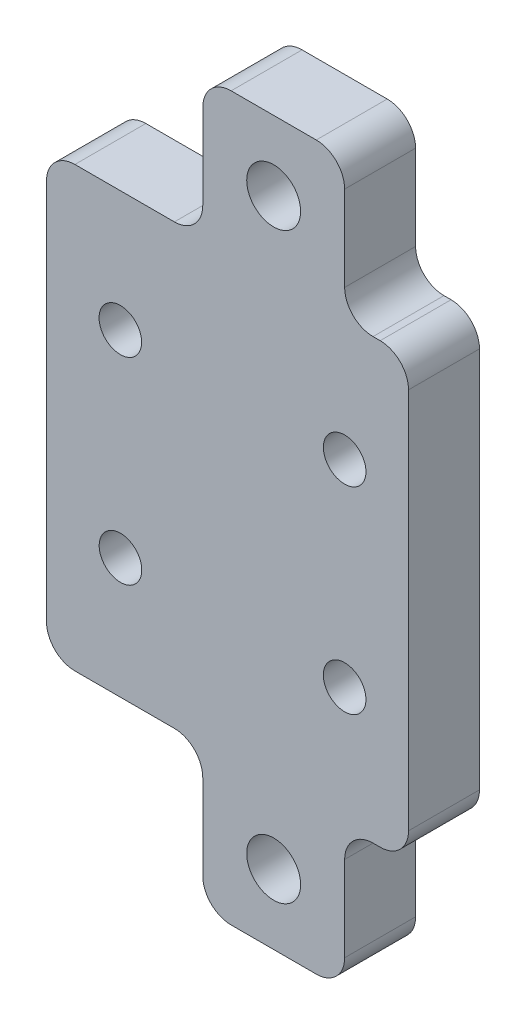
ISO-10303-21;
HEADER;
FILE_DESCRIPTION(('STEP AP214'),'2;1');
FILE_NAME('part.step','',(''),(''),'','','');
FILE_SCHEMA(('AUTOMOTIVE_DESIGN { 1 0 10303 214 1 1 1 1 }'));
ENDSEC;
DATA;
#1=APPLICATION_CONTEXT('core data for automotive mechanical design processes');
#2=APPLICATION_PROTOCOL_DEFINITION('international standard','automotive_design',2000,#1);
#3=PRODUCT_CONTEXT('',#1,'mechanical');
#4=PRODUCT('Part','Part','',(#3));
#5=PRODUCT_RELATED_PRODUCT_CATEGORY('part','',(#4));
#6=PRODUCT_DEFINITION_FORMATION('','',#4);
#7=PRODUCT_DEFINITION_CONTEXT('part definition',#1,'design');
#8=PRODUCT_DEFINITION('design','',#6,#7);
#9=PRODUCT_DEFINITION_SHAPE('','',#8);
#10=(LENGTH_UNIT() NAMED_UNIT(*) SI_UNIT(.MILLI.,.METRE.));
#11=(NAMED_UNIT(*) PLANE_ANGLE_UNIT() SI_UNIT($,.RADIAN.));
#12=(NAMED_UNIT(*) SI_UNIT($,.STERADIAN.) SOLID_ANGLE_UNIT());
#13=UNCERTAINTY_MEASURE_WITH_UNIT(LENGTH_MEASURE(1.E-05),#10,'distance_accuracy_value','');
#14=(GEOMETRIC_REPRESENTATION_CONTEXT(3) GLOBAL_UNCERTAINTY_ASSIGNED_CONTEXT((#13)) GLOBAL_UNIT_ASSIGNED_CONTEXT((#10,
#11,#12)) REPRESENTATION_CONTEXT('',''));
#15=CARTESIAN_POINT('',(0.,0.,0.));
#16=DIRECTION('',(0.,0.,1.));
#17=DIRECTION('',(1.,0.,0.));
#18=AXIS2_PLACEMENT_3D('',#15,#16,#17);
#19=CARTESIAN_POINT('',(-2.99733029540138,-264.787047369331,5.));
#20=DIRECTION('',(0.,0.,1.));
#21=DIRECTION('',(1.,0.,0.));
#22=AXIS2_PLACEMENT_3D('',#19,#20,#21);
#23=PLANE('',#22);
#24=CARTESIAN_POINT('',(5.00266970459864,-248.275086094937,5.));
#25=DIRECTION('',(0.,0.,1.));
#26=DIRECTION('',(1.,0.,0.));
#27=AXIS2_PLACEMENT_3D('',#24,#25,#26);
#28=CIRCLE('',#27,1.49999999999999);
#29=CARTESIAN_POINT('',(6.50266970459863,-248.275086094937,5.));
#30=VERTEX_POINT('',#29);
#31=EDGE_CURVE('E534',#30,#30,#28,.T.);
#32=ORIENTED_EDGE('',*,*,#31,.F.);
#33=EDGE_LOOP('',(#32));
#34=FACE_BOUND('',#33,.T.);
#35=CARTESIAN_POINT('',(0.,-261.876090751215,5.));
#36=DIRECTION('',(0.,0.,1.));
#37=DIRECTION('',(1.,0.,0.));
#38=AXIS2_PLACEMENT_3D('',#35,#36,#37);
#39=CIRCLE('',#38,1.90000000000001);
#40=CARTESIAN_POINT('',(1.90000000000001,-261.876090751215,5.));
#41=VERTEX_POINT('',#40);
#42=EDGE_CURVE('E550',#41,#41,#39,.T.);
#43=ORIENTED_EDGE('',*,*,#42,.F.);
#44=EDGE_LOOP('',(#43));
#45=FACE_BOUND('',#44,.T.);
#46=CARTESIAN_POINT('',(5.00266970459862,-234.375086094937,5.));
#47=DIRECTION('',(0.,0.,1.));
#48=DIRECTION('',(1.,0.,0.));
#49=AXIS2_PLACEMENT_3D('',#46,#47,#48);
#50=CIRCLE('',#49,1.50080097819596);
#51=CARTESIAN_POINT('',(6.50347068279458,-234.375086094937,5.));
#52=VERTEX_POINT('',#51);
#53=EDGE_CURVE('E244',#52,#52,#50,.T.);
#54=ORIENTED_EDGE('',*,*,#53,.F.);
#55=EDGE_LOOP('',(#54));
#56=FACE_BOUND('',#55,.T.);
#57=CARTESIAN_POINT('',(-2.99733029540138,-264.787047369331,5.));
#58=DIRECTION('',(0.,0.,1.));
#59=DIRECTION('',(1.,0.,0.));
#60=AXIS2_PLACEMENT_3D('',#57,#58,#59);
#61=CIRCLE('',#60,2.);
#62=CARTESIAN_POINT('',(-4.99733029540138,-264.787047369331,5.));
#63=VERTEX_POINT('',#62);
#64=CARTESIAN_POINT('',(-2.99733029540136,-266.787047369331,5.));
#65=VERTEX_POINT('',#64);
#66=EDGE_CURVE('E310',#63,#65,#61,.T.);
#67=ORIENTED_EDGE('',*,*,#66,.T.);
#68=DIRECTION('',(1.,0.,0.));
#69=VECTOR('',#68,1.);
#70=CARTESIAN_POINT('',(-2.99733029540136,-266.787047369331,5.));
#71=LINE('',#70,#69);
#72=CARTESIAN_POINT('',(3.00266970459861,-266.787047369331,5.));
#73=VERTEX_POINT('',#72);
#74=EDGE_CURVE('E150',#65,#73,#71,.T.);
#75=ORIENTED_EDGE('',*,*,#74,.T.);
#76=CARTESIAN_POINT('',(3.00266970459862,-264.787047369331,5.));
#77=DIRECTION('',(0.,0.,1.));
#78=DIRECTION('',(1.,0.,0.));
#79=AXIS2_PLACEMENT_3D('',#76,#77,#78);
#80=CIRCLE('',#79,2.);
#81=CARTESIAN_POINT('',(5.00266970459862,-264.787047369331,5.));
#82=VERTEX_POINT('',#81);
#83=EDGE_CURVE('E395',#73,#82,#80,.T.);
#84=ORIENTED_EDGE('',*,*,#83,.T.);
#85=DIRECTION('',(0.,1.,0.));
#86=VECTOR('',#85,1.);
#87=CARTESIAN_POINT('',(5.00266970459862,-258.787047369331,5.));
#88=LINE('',#87,#86);
#89=CARTESIAN_POINT('',(5.00266970459862,-258.787047369331,5.));
#90=VERTEX_POINT('',#89);
#91=EDGE_CURVE('E415',#82,#90,#88,.T.);
#92=ORIENTED_EDGE('',*,*,#91,.T.);
#93=CARTESIAN_POINT('',(7.00266970459862,-258.787047369331,5.));
#94=DIRECTION('',(0.,0.,-1.));
#95=DIRECTION('',(1.,0.,0.));
#96=AXIS2_PLACEMENT_3D('',#93,#94,#95);
#97=CIRCLE('',#96,2.);
#98=CARTESIAN_POINT('',(7.00266970459864,-256.787047369331,5.));
#99=VERTEX_POINT('',#98);
#100=EDGE_CURVE('E411',#90,#99,#97,.T.);
#101=ORIENTED_EDGE('',*,*,#100,.T.);
#102=DIRECTION('',(1.,0.,0.));
#103=VECTOR('',#102,1.);
#104=CARTESIAN_POINT('',(7.50507286190779,-256.787047369331,5.));
#105=LINE('',#104,#103);
#106=CARTESIAN_POINT('',(7.50507286190779,-256.787047369331,5.));
#107=VERTEX_POINT('',#106);
#108=EDGE_CURVE('E414',#99,#107,#105,.T.);
#109=ORIENTED_EDGE('',*,*,#108,.T.);
#110=CARTESIAN_POINT('',(7.50507286190781,-254.787047369331,5.));
#111=DIRECTION('',(0.,0.,1.));
#112=DIRECTION('',(-1.,0.,0.));
#113=AXIS2_PLACEMENT_3D('',#110,#111,#112);
#114=CIRCLE('',#113,2.);
#115=CARTESIAN_POINT('',(9.50507286190781,-254.787047369331,5.));
#116=VERTEX_POINT('',#115);
#117=EDGE_CURVE('E419',#107,#116,#114,.T.);
#118=ORIENTED_EDGE('',*,*,#117,.T.);
#119=DIRECTION('',(0.,1.,0.));
#120=VECTOR('',#119,1.);
#121=CARTESIAN_POINT('',(9.50507286190781,-227.870547218494,5.));
#122=LINE('',#121,#120);
#123=CARTESIAN_POINT('',(9.50507286190781,-227.870547218494,5.));
#124=VERTEX_POINT('',#123);
#125=EDGE_CURVE('E426',#116,#124,#122,.T.);
#126=ORIENTED_EDGE('',*,*,#125,.T.);
#127=CARTESIAN_POINT('',(7.50507286190781,-227.870547218494,5.));
#128=DIRECTION('',(0.,0.,1.));
#129=DIRECTION('',(-1.,0.,0.));
#130=AXIS2_PLACEMENT_3D('',#127,#128,#129);
#131=CIRCLE('',#130,2.);
#132=CARTESIAN_POINT('',(7.50507286190779,-225.870547218494,5.));
#133=VERTEX_POINT('',#132);
#134=EDGE_CURVE('E429',#124,#133,#131,.T.);
#135=ORIENTED_EDGE('',*,*,#134,.T.);
#136=DIRECTION('',(-1.,0.,0.));
#137=VECTOR('',#136,1.);
#138=CARTESIAN_POINT('',(7.50507286190779,-225.870547218494,5.));
#139=LINE('',#138,#137);
#140=CARTESIAN_POINT('',(7.00266970459864,-225.870547218494,5.));
#141=VERTEX_POINT('',#140);
#142=EDGE_CURVE('E432',#133,#141,#139,.T.);
#143=ORIENTED_EDGE('',*,*,#142,.T.);
#144=CARTESIAN_POINT('',(7.00266970459862,-223.870547218494,5.));
#145=DIRECTION('',(0.,0.,-1.));
#146=DIRECTION('',(-1.,0.,0.));
#147=AXIS2_PLACEMENT_3D('',#144,#145,#146);
#148=CIRCLE('',#147,2.);
#149=CARTESIAN_POINT('',(5.00266970459862,-223.870547218494,5.));
#150=VERTEX_POINT('',#149);
#151=EDGE_CURVE('E435',#141,#150,#148,.T.);
#152=ORIENTED_EDGE('',*,*,#151,.T.);
#153=DIRECTION('',(0.,1.,0.));
#154=VECTOR('',#153,1.);
#155=CARTESIAN_POINT('',(5.00266970459862,-223.870547218494,5.));
#156=LINE('',#155,#154);
#157=CARTESIAN_POINT('',(5.00266970459862,-217.870547218494,5.));
#158=VERTEX_POINT('',#157);
#159=EDGE_CURVE('E438',#150,#158,#156,.T.);
#160=ORIENTED_EDGE('',*,*,#159,.T.);
#161=CARTESIAN_POINT('',(3.00266970459862,-217.870547218494,5.));
#162=DIRECTION('',(0.,0.,1.));
#163=DIRECTION('',(-1.,0.,0.));
#164=AXIS2_PLACEMENT_3D('',#161,#162,#163);
#165=CIRCLE('',#164,2.);
#166=CARTESIAN_POINT('',(3.00266970459861,-215.870547218494,5.));
#167=VERTEX_POINT('',#166);
#168=EDGE_CURVE('E441',#158,#167,#165,.T.);
#169=ORIENTED_EDGE('',*,*,#168,.T.);
#170=DIRECTION('',(-1.,0.,0.));
#171=VECTOR('',#170,1.);
#172=CARTESIAN_POINT('',(-2.99733029540136,-215.870547218494,5.));
#173=LINE('',#172,#171);
#174=CARTESIAN_POINT('',(-2.99733029540136,-215.870547218494,5.));
#175=VERTEX_POINT('',#174);
#176=EDGE_CURVE('E444',#167,#175,#173,.T.);
#177=ORIENTED_EDGE('',*,*,#176,.T.);
#178=CARTESIAN_POINT('',(-2.99733029540138,-217.870547218494,5.));
#179=DIRECTION('',(0.,0.,1.));
#180=DIRECTION('',(-1.,0.,0.));
#181=AXIS2_PLACEMENT_3D('',#178,#179,#180);
#182=CIRCLE('',#181,2.);
#183=CARTESIAN_POINT('',(-4.99733029540138,-217.870547218494,5.));
#184=VERTEX_POINT('',#183);
#185=EDGE_CURVE('E447',#175,#184,#182,.T.);
#186=ORIENTED_EDGE('',*,*,#185,.T.);
#187=DIRECTION('',(0.,-1.,0.));
#188=VECTOR('',#187,1.);
#189=CARTESIAN_POINT('',(-4.99733029540138,-223.870547218494,5.));
#190=LINE('',#189,#188);
#191=CARTESIAN_POINT('',(-4.99733029540138,-223.870547218494,5.));
#192=VERTEX_POINT('',#191);
#193=EDGE_CURVE('E450',#184,#192,#190,.T.);
#194=ORIENTED_EDGE('',*,*,#193,.T.);
#195=CARTESIAN_POINT('',(-6.99733029540138,-223.870547218494,5.));
#196=DIRECTION('',(0.,0.,-1.));
#197=DIRECTION('',(1.,0.,0.));
#198=AXIS2_PLACEMENT_3D('',#195,#196,#197);
#199=CIRCLE('',#198,2.);
#200=CARTESIAN_POINT('',(-6.99733029540139,-225.870547218494,5.));
#201=VERTEX_POINT('',#200);
#202=EDGE_CURVE('E453',#192,#201,#199,.T.);
#203=ORIENTED_EDGE('',*,*,#202,.T.);
#204=DIRECTION('',(-1.,0.,0.));
#205=VECTOR('',#204,1.);
#206=CARTESIAN_POINT('',(-6.99733029540139,-225.870547218494,5.));
#207=LINE('',#206,#205);
#208=CARTESIAN_POINT('',(-14.0085439901449,-225.870547218494,5.));
#209=VERTEX_POINT('',#208);
#210=EDGE_CURVE('E456',#201,#209,#207,.T.);
#211=ORIENTED_EDGE('',*,*,#210,.T.);
#212=CARTESIAN_POINT('',(-14.008543990145,-227.870547218494,5.));
#213=DIRECTION('',(0.,0.,1.));
#214=DIRECTION('',(1.,0.,0.));
#215=AXIS2_PLACEMENT_3D('',#212,#213,#214);
#216=CIRCLE('',#215,2.);
#217=CARTESIAN_POINT('',(-16.008543990145,-227.870547218494,5.));
#218=VERTEX_POINT('',#217);
#219=EDGE_CURVE('E459',#209,#218,#216,.T.);
#220=ORIENTED_EDGE('',*,*,#219,.T.);
#221=DIRECTION('',(0.,-1.,0.));
#222=VECTOR('',#221,1.);
#223=CARTESIAN_POINT('',(-16.008543990145,-227.870547218494,5.));
#224=LINE('',#223,#222);
#225=CARTESIAN_POINT('',(-16.008543990145,-254.787047369331,5.));
#226=VERTEX_POINT('',#225);
#227=EDGE_CURVE('E462',#218,#226,#224,.T.);
#228=ORIENTED_EDGE('',*,*,#227,.T.);
#229=CARTESIAN_POINT('',(-14.008543990145,-254.787047369331,5.));
#230=DIRECTION('',(0.,0.,1.));
#231=DIRECTION('',(-1.,0.,0.));
#232=AXIS2_PLACEMENT_3D('',#229,#230,#231);
#233=CIRCLE('',#232,2.);
#234=CARTESIAN_POINT('',(-14.0085439901449,-256.787047369331,5.));
#235=VERTEX_POINT('',#234);
#236=EDGE_CURVE('E217',#226,#235,#233,.T.);
#237=ORIENTED_EDGE('',*,*,#236,.T.);
#238=DIRECTION('',(1.,0.,0.));
#239=VECTOR('',#238,1.);
#240=CARTESIAN_POINT('',(-6.99733029540139,-256.787047369331,5.));
#241=LINE('',#240,#239);
#242=CARTESIAN_POINT('',(-6.99733029540139,-256.787047369331,5.));
#243=VERTEX_POINT('',#242);
#244=EDGE_CURVE('E211',#235,#243,#241,.T.);
#245=ORIENTED_EDGE('',*,*,#244,.T.);
#246=CARTESIAN_POINT('',(-6.99733029540138,-258.787047369331,5.));
#247=DIRECTION('',(0.,0.,-1.));
#248=DIRECTION('',(-1.,0.,0.));
#249=AXIS2_PLACEMENT_3D('',#246,#247,#248);
#250=CIRCLE('',#249,2.);
#251=CARTESIAN_POINT('',(-4.99733029540138,-258.787047369331,5.));
#252=VERTEX_POINT('',#251);
#253=EDGE_CURVE('E215',#243,#252,#250,.T.);
#254=ORIENTED_EDGE('',*,*,#253,.T.);
#255=DIRECTION('',(0.,-1.,0.));
#256=VECTOR('',#255,1.);
#257=CARTESIAN_POINT('',(-4.99733029540138,-258.787047369331,5.));
#258=LINE('',#257,#256);
#259=EDGE_CURVE('E59',#252,#63,#258,.T.);
#260=ORIENTED_EDGE('',*,*,#259,.T.);
#261=EDGE_LOOP('',(#67,#75,#84,#92,#101,#109,#118,#126,#135,#143,#152,#160,#169,#177,#186,#194,
#203,#211,#220,#228,#237,#245,#254,#260));
#262=FACE_BOUND('',#261,.T.);
#263=CARTESIAN_POINT('',(-10.8057672657323,-234.375086094937,5.));
#264=DIRECTION('',(0.,0.,1.));
#265=DIRECTION('',(1.,0.,0.));
#266=AXIS2_PLACEMENT_3D('',#263,#264,#265);
#267=CIRCLE('',#266,1.50080097819596);
#268=CARTESIAN_POINT('',(-9.3049662875363,-234.375086094937,5.));
#269=VERTEX_POINT('',#268);
#270=EDGE_CURVE('E558',#269,#269,#267,.T.);
#271=ORIENTED_EDGE('',*,*,#270,.F.);
#272=EDGE_LOOP('',(#271));
#273=FACE_BOUND('',#272,.T.);
#274=CARTESIAN_POINT('',(0.,-220.781503836609,5.));
#275=DIRECTION('',(0.,0.,1.));
#276=DIRECTION('',(-1.,0.,0.));
#277=AXIS2_PLACEMENT_3D('',#274,#275,#276);
#278=CIRCLE('',#277,1.90000000000001);
#279=CARTESIAN_POINT('',(-1.90000000000001,-220.781503836609,5.));
#280=VERTEX_POINT('',#279);
#281=EDGE_CURVE('E542',#280,#280,#278,.T.);
#282=ORIENTED_EDGE('',*,*,#281,.F.);
#283=EDGE_LOOP('',(#282));
#284=FACE_BOUND('',#283,.T.);
#285=CARTESIAN_POINT('',(-10.7973302954014,-248.275086094937,5.));
#286=DIRECTION('',(0.,0.,1.));
#287=DIRECTION('',(1.,0.,0.));
#288=AXIS2_PLACEMENT_3D('',#285,#286,#287);
#289=CIRCLE('',#288,1.49999999999999);
#290=CARTESIAN_POINT('',(-9.29733029540137,-248.275086094937,5.));
#291=VERTEX_POINT('',#290);
#292=EDGE_CURVE('E523',#291,#291,#289,.T.);
#293=ORIENTED_EDGE('',*,*,#292,.F.);
#294=EDGE_LOOP('',(#293));
#295=FACE_BOUND('',#294,.T.);
#296=ADVANCED_FACE('F41',(#34,#45,#56,#262,#273,#284,#295),#23,.T.);
#297=CARTESIAN_POINT('',(-2.99733029540138,-264.787047369331,0.));
#298=DIRECTION('',(0.,0.,1.));
#299=DIRECTION('',(1.,0.,0.));
#300=AXIS2_PLACEMENT_3D('',#297,#298,#299);
#301=PLANE('',#300);
#302=CARTESIAN_POINT('',(-2.99733029540138,-264.787047369331,0.));
#303=DIRECTION('',(0.,0.,1.));
#304=DIRECTION('',(1.,0.,0.));
#305=AXIS2_PLACEMENT_3D('',#302,#303,#304);
#306=CIRCLE('',#305,2.);
#307=CARTESIAN_POINT('',(-4.99733029540138,-264.787047369331,0.));
#308=VERTEX_POINT('',#307);
#309=CARTESIAN_POINT('',(-2.99733029540136,-266.787047369331,0.));
#310=VERTEX_POINT('',#309);
#311=EDGE_CURVE('E239',#308,#310,#306,.T.);
#312=ORIENTED_EDGE('',*,*,#311,.F.);
#313=DIRECTION('',(0.,-1.,0.));
#314=VECTOR('',#313,1.);
#315=CARTESIAN_POINT('',(-4.99733029540138,-258.787047369331,0.));
#316=LINE('',#315,#314);
#317=CARTESIAN_POINT('',(-4.99733029540138,-258.787047369331,0.));
#318=VERTEX_POINT('',#317);
#319=EDGE_CURVE('E142',#318,#308,#316,.T.);
#320=ORIENTED_EDGE('',*,*,#319,.F.);
#321=CARTESIAN_POINT('',(-6.99733029540138,-258.787047369331,0.));
#322=DIRECTION('',(0.,0.,-1.));
#323=DIRECTION('',(-1.,0.,0.));
#324=AXIS2_PLACEMENT_3D('',#321,#322,#323);
#325=CIRCLE('',#324,2.);
#326=CARTESIAN_POINT('',(-6.99733029540139,-256.787047369331,0.));
#327=VERTEX_POINT('',#326);
#328=EDGE_CURVE('E136',#327,#318,#325,.T.);
#329=ORIENTED_EDGE('',*,*,#328,.F.);
#330=DIRECTION('',(1.,0.,0.));
#331=VECTOR('',#330,1.);
#332=CARTESIAN_POINT('',(-6.99733029540139,-256.787047369331,0.));
#333=LINE('',#332,#331);
#334=CARTESIAN_POINT('',(-14.0085439901449,-256.787047369331,0.));
#335=VERTEX_POINT('',#334);
#336=EDGE_CURVE('E226',#335,#327,#333,.T.);
#337=ORIENTED_EDGE('',*,*,#336,.F.);
#338=CARTESIAN_POINT('',(-14.008543990145,-254.787047369331,0.));
#339=DIRECTION('',(0.,0.,1.));
#340=DIRECTION('',(-1.,0.,0.));
#341=AXIS2_PLACEMENT_3D('',#338,#339,#340);
#342=CIRCLE('',#341,2.);
#343=CARTESIAN_POINT('',(-16.008543990145,-254.787047369331,0.));
#344=VERTEX_POINT('',#343);
#345=EDGE_CURVE('E301',#344,#335,#342,.T.);
#346=ORIENTED_EDGE('',*,*,#345,.F.);
#347=DIRECTION('',(0.,-1.,0.));
#348=VECTOR('',#347,1.);
#349=CARTESIAN_POINT('',(-16.008543990145,-227.870547218494,0.));
#350=LINE('',#349,#348);
#351=CARTESIAN_POINT('',(-16.008543990145,-227.870547218494,0.));
#352=VERTEX_POINT('',#351);
#353=EDGE_CURVE('E298',#352,#344,#350,.T.);
#354=ORIENTED_EDGE('',*,*,#353,.F.);
#355=CARTESIAN_POINT('',(-14.008543990145,-227.870547218494,0.));
#356=DIRECTION('',(0.,0.,1.));
#357=DIRECTION('',(1.,0.,0.));
#358=AXIS2_PLACEMENT_3D('',#355,#356,#357);
#359=CIRCLE('',#358,2.);
#360=CARTESIAN_POINT('',(-14.0085439901449,-225.870547218494,0.));
#361=VERTEX_POINT('',#360);
#362=EDGE_CURVE('E295',#361,#352,#359,.T.);
#363=ORIENTED_EDGE('',*,*,#362,.F.);
#364=DIRECTION('',(-1.,0.,0.));
#365=VECTOR('',#364,1.);
#366=CARTESIAN_POINT('',(-6.99733029540139,-225.870547218494,0.));
#367=LINE('',#366,#365);
#368=CARTESIAN_POINT('',(-6.99733029540139,-225.870547218494,0.));
#369=VERTEX_POINT('',#368);
#370=EDGE_CURVE('E292',#369,#361,#367,.T.);
#371=ORIENTED_EDGE('',*,*,#370,.F.);
#372=CARTESIAN_POINT('',(-6.99733029540138,-223.870547218494,0.));
#373=DIRECTION('',(0.,0.,-1.));
#374=DIRECTION('',(1.,0.,0.));
#375=AXIS2_PLACEMENT_3D('',#372,#373,#374);
#376=CIRCLE('',#375,2.);
#377=CARTESIAN_POINT('',(-4.99733029540138,-223.870547218494,0.));
#378=VERTEX_POINT('',#377);
#379=EDGE_CURVE('E289',#378,#369,#376,.T.);
#380=ORIENTED_EDGE('',*,*,#379,.F.);
#381=DIRECTION('',(0.,-1.,0.));
#382=VECTOR('',#381,1.);
#383=CARTESIAN_POINT('',(-4.99733029540138,-223.870547218494,0.));
#384=LINE('',#383,#382);
#385=CARTESIAN_POINT('',(-4.99733029540138,-217.870547218494,0.));
#386=VERTEX_POINT('',#385);
#387=EDGE_CURVE('E286',#386,#378,#384,.T.);
#388=ORIENTED_EDGE('',*,*,#387,.F.);
#389=CARTESIAN_POINT('',(-2.99733029540138,-217.870547218494,0.));
#390=DIRECTION('',(0.,0.,1.));
#391=DIRECTION('',(-1.,0.,0.));
#392=AXIS2_PLACEMENT_3D('',#389,#390,#391);
#393=CIRCLE('',#392,2.);
#394=CARTESIAN_POINT('',(-2.99733029540136,-215.870547218494,0.));
#395=VERTEX_POINT('',#394);
#396=EDGE_CURVE('E283',#395,#386,#393,.T.);
#397=ORIENTED_EDGE('',*,*,#396,.F.);
#398=DIRECTION('',(-1.,0.,0.));
#399=VECTOR('',#398,1.);
#400=CARTESIAN_POINT('',(-2.99733029540136,-215.870547218494,0.));
#401=LINE('',#400,#399);
#402=CARTESIAN_POINT('',(3.00266970459861,-215.870547218494,0.));
#403=VERTEX_POINT('',#402);
#404=EDGE_CURVE('E280',#403,#395,#401,.T.);
#405=ORIENTED_EDGE('',*,*,#404,.F.);
#406=CARTESIAN_POINT('',(3.00266970459862,-217.870547218494,0.));
#407=DIRECTION('',(0.,0.,1.));
#408=DIRECTION('',(-1.,0.,0.));
#409=AXIS2_PLACEMENT_3D('',#406,#407,#408);
#410=CIRCLE('',#409,2.);
#411=CARTESIAN_POINT('',(5.00266970459862,-217.870547218494,0.));
#412=VERTEX_POINT('',#411);
#413=EDGE_CURVE('E277',#412,#403,#410,.T.);
#414=ORIENTED_EDGE('',*,*,#413,.F.);
#415=DIRECTION('',(0.,1.,0.));
#416=VECTOR('',#415,1.);
#417=CARTESIAN_POINT('',(5.00266970459862,-223.870547218494,0.));
#418=LINE('',#417,#416);
#419=CARTESIAN_POINT('',(5.00266970459862,-223.870547218494,0.));
#420=VERTEX_POINT('',#419);
#421=EDGE_CURVE('E274',#420,#412,#418,.T.);
#422=ORIENTED_EDGE('',*,*,#421,.F.);
#423=CARTESIAN_POINT('',(7.00266970459862,-223.870547218494,0.));
#424=DIRECTION('',(0.,0.,-1.));
#425=DIRECTION('',(-1.,0.,0.));
#426=AXIS2_PLACEMENT_3D('',#423,#424,#425);
#427=CIRCLE('',#426,2.);
#428=CARTESIAN_POINT('',(7.00266970459864,-225.870547218494,0.));
#429=VERTEX_POINT('',#428);
#430=EDGE_CURVE('E271',#429,#420,#427,.T.);
#431=ORIENTED_EDGE('',*,*,#430,.F.);
#432=DIRECTION('',(-1.,0.,0.));
#433=VECTOR('',#432,1.);
#434=CARTESIAN_POINT('',(7.50507286190779,-225.870547218494,0.));
#435=LINE('',#434,#433);
#436=CARTESIAN_POINT('',(7.50507286190779,-225.870547218494,0.));
#437=VERTEX_POINT('',#436);
#438=EDGE_CURVE('E268',#437,#429,#435,.T.);
#439=ORIENTED_EDGE('',*,*,#438,.F.);
#440=CARTESIAN_POINT('',(7.50507286190781,-227.870547218494,0.));
#441=DIRECTION('',(0.,0.,1.));
#442=DIRECTION('',(-1.,0.,0.));
#443=AXIS2_PLACEMENT_3D('',#440,#441,#442);
#444=CIRCLE('',#443,2.);
#445=CARTESIAN_POINT('',(9.50507286190781,-227.870547218494,0.));
#446=VERTEX_POINT('',#445);
#447=EDGE_CURVE('E265',#446,#437,#444,.T.);
#448=ORIENTED_EDGE('',*,*,#447,.F.);
#449=DIRECTION('',(0.,1.,0.));
#450=VECTOR('',#449,1.);
#451=CARTESIAN_POINT('',(9.50507286190781,-227.870547218494,0.));
#452=LINE('',#451,#450);
#453=CARTESIAN_POINT('',(9.50507286190781,-254.787047369331,0.));
#454=VERTEX_POINT('',#453);
#455=EDGE_CURVE('E262',#454,#446,#452,.T.);
#456=ORIENTED_EDGE('',*,*,#455,.F.);
#457=CARTESIAN_POINT('',(7.50507286190781,-254.787047369331,0.));
#458=DIRECTION('',(0.,0.,1.));
#459=DIRECTION('',(-1.,0.,0.));
#460=AXIS2_PLACEMENT_3D('',#457,#458,#459);
#461=CIRCLE('',#460,2.);
#462=CARTESIAN_POINT('',(7.50507286190779,-256.787047369331,0.));
#463=VERTEX_POINT('',#462);
#464=EDGE_CURVE('E259',#463,#454,#461,.T.);
#465=ORIENTED_EDGE('',*,*,#464,.F.);
#466=DIRECTION('',(1.,0.,0.));
#467=VECTOR('',#466,1.);
#468=CARTESIAN_POINT('',(7.50507286190779,-256.787047369331,0.));
#469=LINE('',#468,#467);
#470=CARTESIAN_POINT('',(7.00266970459864,-256.787047369331,0.));
#471=VERTEX_POINT('',#470);
#472=EDGE_CURVE('E256',#471,#463,#469,.T.);
#473=ORIENTED_EDGE('',*,*,#472,.F.);
#474=CARTESIAN_POINT('',(7.00266970459862,-258.787047369331,0.));
#475=DIRECTION('',(0.,0.,-1.));
#476=DIRECTION('',(1.,0.,0.));
#477=AXIS2_PLACEMENT_3D('',#474,#475,#476);
#478=CIRCLE('',#477,2.);
#479=CARTESIAN_POINT('',(5.00266970459862,-258.787047369331,0.));
#480=VERTEX_POINT('',#479);
#481=EDGE_CURVE('E253',#480,#471,#478,.T.);
#482=ORIENTED_EDGE('',*,*,#481,.F.);
#483=DIRECTION('',(0.,1.,0.));
#484=VECTOR('',#483,1.);
#485=CARTESIAN_POINT('',(5.00266970459862,-258.787047369331,0.));
#486=LINE('',#485,#484);
#487=CARTESIAN_POINT('',(5.00266970459862,-264.787047369331,0.));
#488=VERTEX_POINT('',#487);
#489=EDGE_CURVE('E250',#488,#480,#486,.T.);
#490=ORIENTED_EDGE('',*,*,#489,.F.);
#491=CARTESIAN_POINT('',(3.00266970459862,-264.787047369331,0.));
#492=DIRECTION('',(0.,0.,1.));
#493=DIRECTION('',(1.,0.,0.));
#494=AXIS2_PLACEMENT_3D('',#491,#492,#493);
#495=CIRCLE('',#494,2.);
#496=CARTESIAN_POINT('',(3.00266970459861,-266.787047369331,0.));
#497=VERTEX_POINT('',#496);
#498=EDGE_CURVE('E247',#497,#488,#495,.T.);
#499=ORIENTED_EDGE('',*,*,#498,.F.);
#500=DIRECTION('',(1.,0.,0.));
#501=VECTOR('',#500,1.);
#502=CARTESIAN_POINT('',(-2.99733029540136,-266.787047369331,0.));
#503=LINE('',#502,#501);
#504=EDGE_CURVE('E243',#310,#497,#503,.T.);
#505=ORIENTED_EDGE('',*,*,#504,.F.);
#506=EDGE_LOOP('',(#312,#320,#329,#337,#346,#354,#363,#371,#380,#388,#397,#405,#414,#422,#431,
#439,#448,#456,#465,#473,#482,#490,#499,#505));
#507=FACE_BOUND('',#506,.T.);
#508=CARTESIAN_POINT('',(5.00266970459862,-234.375086094937,0.));
#509=DIRECTION('',(0.,0.,1.));
#510=DIRECTION('',(1.,0.,0.));
#511=AXIS2_PLACEMENT_3D('',#508,#509,#510);
#512=CIRCLE('',#511,1.50080097819596);
#513=CARTESIAN_POINT('',(6.50347068279458,-234.375086094937,0.));
#514=VERTEX_POINT('',#513);
#515=EDGE_CURVE('E562',#514,#514,#512,.T.);
#516=ORIENTED_EDGE('',*,*,#515,.T.);
#517=EDGE_LOOP('',(#516));
#518=FACE_BOUND('',#517,.T.);
#519=CARTESIAN_POINT('',(-10.8057672657323,-234.375086094937,0.));
#520=DIRECTION('',(0.,0.,1.));
#521=DIRECTION('',(1.,0.,0.));
#522=AXIS2_PLACEMENT_3D('',#519,#520,#521);
#523=CIRCLE('',#522,1.50080097819596);
#524=CARTESIAN_POINT('',(-9.3049662875363,-234.375086094937,0.));
#525=VERTEX_POINT('',#524);
#526=EDGE_CURVE('E554',#525,#525,#523,.T.);
#527=ORIENTED_EDGE('',*,*,#526,.T.);
#528=EDGE_LOOP('',(#527));
#529=FACE_BOUND('',#528,.T.);
#530=CARTESIAN_POINT('',(0.,-261.876090751215,0.));
#531=DIRECTION('',(0.,0.,1.));
#532=DIRECTION('',(1.,0.,0.));
#533=AXIS2_PLACEMENT_3D('',#530,#531,#532);
#534=CIRCLE('',#533,1.90000000000001);
#535=CARTESIAN_POINT('',(1.90000000000001,-261.876090751215,0.));
#536=VERTEX_POINT('',#535);
#537=EDGE_CURVE('E546',#536,#536,#534,.T.);
#538=ORIENTED_EDGE('',*,*,#537,.T.);
#539=EDGE_LOOP('',(#538));
#540=FACE_BOUND('',#539,.T.);
#541=CARTESIAN_POINT('',(0.,-220.781503836609,0.));
#542=DIRECTION('',(0.,0.,1.));
#543=DIRECTION('',(-1.,0.,0.));
#544=AXIS2_PLACEMENT_3D('',#541,#542,#543);
#545=CIRCLE('',#544,1.90000000000001);
#546=CARTESIAN_POINT('',(-1.90000000000001,-220.781503836609,0.));
#547=VERTEX_POINT('',#546);
#548=EDGE_CURVE('E538',#547,#547,#545,.T.);
#549=ORIENTED_EDGE('',*,*,#548,.T.);
#550=EDGE_LOOP('',(#549));
#551=FACE_BOUND('',#550,.T.);
#552=CARTESIAN_POINT('',(5.00266970459864,-248.275086094937,0.));
#553=DIRECTION('',(0.,0.,1.));
#554=DIRECTION('',(1.,0.,0.));
#555=AXIS2_PLACEMENT_3D('',#552,#553,#554);
#556=CIRCLE('',#555,1.49999999999999);
#557=CARTESIAN_POINT('',(6.50266970459863,-248.275086094937,0.));
#558=VERTEX_POINT('',#557);
#559=EDGE_CURVE('E531',#558,#558,#556,.T.);
#560=ORIENTED_EDGE('',*,*,#559,.T.);
#561=EDGE_LOOP('',(#560));
#562=FACE_BOUND('',#561,.T.);
#563=CARTESIAN_POINT('',(-10.7973302954014,-248.275086094937,0.));
#564=DIRECTION('',(0.,0.,1.));
#565=DIRECTION('',(1.,0.,0.));
#566=AXIS2_PLACEMENT_3D('',#563,#564,#565);
#567=CIRCLE('',#566,1.49999999999999);
#568=CARTESIAN_POINT('',(-9.29733029540137,-248.275086094937,0.));
#569=VERTEX_POINT('',#568);
#570=EDGE_CURVE('E526',#569,#569,#567,.T.);
#571=ORIENTED_EDGE('',*,*,#570,.T.);
#572=EDGE_LOOP('',(#571));
#573=FACE_BOUND('',#572,.T.);
#574=ADVANCED_FACE('F399',(#507,#518,#529,#540,#551,#562,#573),#301,.F.);
#575=CARTESIAN_POINT('',(-2.99733029540138,-264.787047369331,5.));
#576=DIRECTION('',(0.,0.,-1.));
#577=DIRECTION('',(-1.,0.,0.));
#578=AXIS2_PLACEMENT_3D('',#575,#576,#577);
#579=CYLINDRICAL_SURFACE('',#578,2.);
#580=ORIENTED_EDGE('',*,*,#311,.T.);
#581=DIRECTION('',(0.,0.,-1.));
#582=VECTOR('',#581,1.);
#583=CARTESIAN_POINT('',(-2.99733029540136,-266.787047369331,5.));
#584=LINE('',#583,#582);
#585=EDGE_CURVE('E11',#65,#310,#584,.T.);
#586=ORIENTED_EDGE('',*,*,#585,.F.);
#587=ORIENTED_EDGE('',*,*,#66,.F.);
#588=DIRECTION('',(0.,0.,-1.));
#589=VECTOR('',#588,1.);
#590=CARTESIAN_POINT('',(-4.99733029540138,-264.787047369331,5.));
#591=LINE('',#590,#589);
#592=EDGE_CURVE('E235',#63,#308,#591,.T.);
#593=ORIENTED_EDGE('',*,*,#592,.T.);
#594=EDGE_LOOP('',(#580,#586,#587,#593));
#595=FACE_BOUND('',#594,.T.);
#596=ADVANCED_FACE('F43',(#595),#579,.T.);
#597=CARTESIAN_POINT('',(-2.99733029540136,-266.787047369331,5.));
#598=DIRECTION('',(0.,1.,0.));
#599=DIRECTION('',(0.,0.,1.));
#600=AXIS2_PLACEMENT_3D('',#597,#598,#599);
#601=PLANE('',#600);
#602=ORIENTED_EDGE('',*,*,#504,.T.);
#603=DIRECTION('',(0.,0.,-1.));
#604=VECTOR('',#603,1.);
#605=CARTESIAN_POINT('',(3.00266970459861,-266.787047369331,5.));
#606=LINE('',#605,#604);
#607=EDGE_CURVE('E51',#73,#497,#606,.T.);
#608=ORIENTED_EDGE('',*,*,#607,.F.);
#609=ORIENTED_EDGE('',*,*,#74,.F.);
#610=ORIENTED_EDGE('',*,*,#585,.T.);
#611=EDGE_LOOP('',(#602,#608,#609,#610));
#612=FACE_BOUND('',#611,.T.);
#613=ADVANCED_FACE('F838',(#612),#601,.F.);
#614=CARTESIAN_POINT('',(3.00266970459862,-264.787047369331,5.));
#615=DIRECTION('',(0.,0.,-1.));
#616=DIRECTION('',(-1.,0.,0.));
#617=AXIS2_PLACEMENT_3D('',#614,#615,#616);
#618=CYLINDRICAL_SURFACE('',#617,2.);
#619=ORIENTED_EDGE('',*,*,#498,.T.);
#620=DIRECTION('',(0.,0.,-1.));
#621=VECTOR('',#620,1.);
#622=CARTESIAN_POINT('',(5.00266970459862,-264.787047369331,5.));
#623=LINE('',#622,#621);
#624=EDGE_CURVE('E385',#82,#488,#623,.T.);
#625=ORIENTED_EDGE('',*,*,#624,.F.);
#626=ORIENTED_EDGE('',*,*,#83,.F.);
#627=ORIENTED_EDGE('',*,*,#607,.T.);
#628=EDGE_LOOP('',(#619,#625,#626,#627));
#629=FACE_BOUND('',#628,.T.);
#630=ADVANCED_FACE('F393',(#629),#618,.T.);
#631=CARTESIAN_POINT('',(5.00266970459862,-258.787047369331,5.));
#632=DIRECTION('',(-1.,0.,0.));
#633=DIRECTION('',(0.,-1.,0.));
#634=AXIS2_PLACEMENT_3D('',#631,#632,#633);
#635=PLANE('',#634);
#636=ORIENTED_EDGE('',*,*,#489,.T.);
#637=DIRECTION('',(0.,0.,-1.));
#638=VECTOR('',#637,1.);
#639=CARTESIAN_POINT('',(5.00266970459862,-258.787047369331,5.));
#640=LINE('',#639,#638);
#641=EDGE_CURVE('E381',#90,#480,#640,.T.);
#642=ORIENTED_EDGE('',*,*,#641,.F.);
#643=ORIENTED_EDGE('',*,*,#91,.F.);
#644=ORIENTED_EDGE('',*,*,#624,.T.);
#645=EDGE_LOOP('',(#636,#642,#643,#644));
#646=FACE_BOUND('',#645,.T.);
#647=ADVANCED_FACE('F405',(#646),#635,.F.);
#648=CARTESIAN_POINT('',(7.00266970459862,-258.787047369331,5.));
#649=DIRECTION('',(0.,0.,-1.));
#650=DIRECTION('',(-1.,0.,0.));
#651=AXIS2_PLACEMENT_3D('',#648,#649,#650);
#652=CYLINDRICAL_SURFACE('',#651,2.);
#653=ORIENTED_EDGE('',*,*,#481,.T.);
#654=DIRECTION('',(0.,0.,-1.));
#655=VECTOR('',#654,1.);
#656=CARTESIAN_POINT('',(7.00266970459864,-256.787047369331,5.));
#657=LINE('',#656,#655);
#658=EDGE_CURVE('E377',#99,#471,#657,.T.);
#659=ORIENTED_EDGE('',*,*,#658,.F.);
#660=ORIENTED_EDGE('',*,*,#100,.F.);
#661=ORIENTED_EDGE('',*,*,#641,.T.);
#662=EDGE_LOOP('',(#653,#659,#660,#661));
#663=FACE_BOUND('',#662,.T.);
#664=ADVANCED_FACE('F409',(#663),#652,.F.);
#665=CARTESIAN_POINT('',(7.50507286190779,-256.787047369331,5.));
#666=DIRECTION('',(0.,1.,0.));
#667=DIRECTION('',(0.,0.,1.));
#668=AXIS2_PLACEMENT_3D('',#665,#666,#667);
#669=PLANE('',#668);
#670=ORIENTED_EDGE('',*,*,#472,.T.);
#671=DIRECTION('',(0.,0.,-1.));
#672=VECTOR('',#671,1.);
#673=CARTESIAN_POINT('',(7.50507286190779,-256.787047369331,5.));
#674=LINE('',#673,#672);
#675=EDGE_CURVE('E373',#107,#463,#674,.T.);
#676=ORIENTED_EDGE('',*,*,#675,.F.);
#677=ORIENTED_EDGE('',*,*,#108,.F.);
#678=ORIENTED_EDGE('',*,*,#658,.T.);
#679=EDGE_LOOP('',(#670,#676,#677,#678));
#680=FACE_BOUND('',#679,.T.);
#681=ADVANCED_FACE('F799',(#680),#669,.F.);
#682=CARTESIAN_POINT('',(7.50507286190781,-254.787047369331,5.));
#683=DIRECTION('',(0.,0.,-1.));
#684=DIRECTION('',(-1.,0.,0.));
#685=AXIS2_PLACEMENT_3D('',#682,#683,#684);
#686=CYLINDRICAL_SURFACE('',#685,2.);
#687=ORIENTED_EDGE('',*,*,#464,.T.);
#688=DIRECTION('',(0.,0.,-1.));
#689=VECTOR('',#688,1.);
#690=CARTESIAN_POINT('',(9.50507286190781,-254.787047369331,5.));
#691=LINE('',#690,#689);
#692=EDGE_CURVE('E369',#116,#454,#691,.T.);
#693=ORIENTED_EDGE('',*,*,#692,.F.);
#694=ORIENTED_EDGE('',*,*,#117,.F.);
#695=ORIENTED_EDGE('',*,*,#675,.T.);
#696=EDGE_LOOP('',(#687,#693,#694,#695));
#697=FACE_BOUND('',#696,.T.);
#698=ADVANCED_FACE('F788',(#697),#686,.T.);
#699=CARTESIAN_POINT('',(9.50507286190781,-227.870547218494,5.));
#700=DIRECTION('',(-1.,0.,0.));
#701=DIRECTION('',(0.,0.,1.));
#702=AXIS2_PLACEMENT_3D('',#699,#700,#701);
#703=PLANE('',#702);
#704=ORIENTED_EDGE('',*,*,#455,.T.);
#705=DIRECTION('',(0.,0.,-1.));
#706=VECTOR('',#705,1.);
#707=CARTESIAN_POINT('',(9.50507286190781,-227.870547218494,5.));
#708=LINE('',#707,#706);
#709=EDGE_CURVE('E365',#124,#446,#708,.T.);
#710=ORIENTED_EDGE('',*,*,#709,.F.);
#711=ORIENTED_EDGE('',*,*,#125,.F.);
#712=ORIENTED_EDGE('',*,*,#692,.T.);
#713=EDGE_LOOP('',(#704,#710,#711,#712));
#714=FACE_BOUND('',#713,.T.);
#715=ADVANCED_FACE('F777',(#714),#703,.F.);
#716=CARTESIAN_POINT('',(7.50507286190781,-227.870547218494,5.));
#717=DIRECTION('',(0.,0.,-1.));
#718=DIRECTION('',(-1.,0.,0.));
#719=AXIS2_PLACEMENT_3D('',#716,#717,#718);
#720=CYLINDRICAL_SURFACE('',#719,2.);
#721=ORIENTED_EDGE('',*,*,#447,.T.);
#722=DIRECTION('',(0.,0.,-1.));
#723=VECTOR('',#722,1.);
#724=CARTESIAN_POINT('',(7.50507286190779,-225.870547218494,5.));
#725=LINE('',#724,#723);
#726=EDGE_CURVE('E361',#133,#437,#725,.T.);
#727=ORIENTED_EDGE('',*,*,#726,.F.);
#728=ORIENTED_EDGE('',*,*,#134,.F.);
#729=ORIENTED_EDGE('',*,*,#709,.T.);
#730=EDGE_LOOP('',(#721,#727,#728,#729));
#731=FACE_BOUND('',#730,.T.);
#732=ADVANCED_FACE('F766',(#731),#720,.T.);
#733=CARTESIAN_POINT('',(7.50507286190779,-225.870547218494,5.));
#734=DIRECTION('',(0.,-1.,0.));
#735=DIRECTION('',(0.,0.,-1.));
#736=AXIS2_PLACEMENT_3D('',#733,#734,#735);
#737=PLANE('',#736);
#738=ORIENTED_EDGE('',*,*,#438,.T.);
#739=DIRECTION('',(0.,0.,-1.));
#740=VECTOR('',#739,1.);
#741=CARTESIAN_POINT('',(7.00266970459864,-225.870547218494,5.));
#742=LINE('',#741,#740);
#743=EDGE_CURVE('E357',#141,#429,#742,.T.);
#744=ORIENTED_EDGE('',*,*,#743,.F.);
#745=ORIENTED_EDGE('',*,*,#142,.F.);
#746=ORIENTED_EDGE('',*,*,#726,.T.);
#747=EDGE_LOOP('',(#738,#744,#745,#746));
#748=FACE_BOUND('',#747,.T.);
#749=ADVANCED_FACE('F755',(#748),#737,.F.);
#750=CARTESIAN_POINT('',(7.00266970459862,-223.870547218494,5.));
#751=DIRECTION('',(0.,0.,-1.));
#752=DIRECTION('',(-1.,0.,0.));
#753=AXIS2_PLACEMENT_3D('',#750,#751,#752);
#754=CYLINDRICAL_SURFACE('',#753,2.);
#755=ORIENTED_EDGE('',*,*,#430,.T.);
#756=DIRECTION('',(0.,0.,-1.));
#757=VECTOR('',#756,1.);
#758=CARTESIAN_POINT('',(5.00266970459862,-223.870547218494,5.));
#759=LINE('',#758,#757);
#760=EDGE_CURVE('E353',#150,#420,#759,.T.);
#761=ORIENTED_EDGE('',*,*,#760,.F.);
#762=ORIENTED_EDGE('',*,*,#151,.F.);
#763=ORIENTED_EDGE('',*,*,#743,.T.);
#764=EDGE_LOOP('',(#755,#761,#762,#763));
#765=FACE_BOUND('',#764,.T.);
#766=ADVANCED_FACE('F744',(#765),#754,.F.);
#767=CARTESIAN_POINT('',(5.00266970459862,-223.870547218494,5.));
#768=DIRECTION('',(-1.,0.,0.));
#769=DIRECTION('',(0.,-1.,0.));
#770=AXIS2_PLACEMENT_3D('',#767,#768,#769);
#771=PLANE('',#770);
#772=ORIENTED_EDGE('',*,*,#421,.T.);
#773=DIRECTION('',(0.,0.,-1.));
#774=VECTOR('',#773,1.);
#775=CARTESIAN_POINT('',(5.00266970459862,-217.870547218494,5.));
#776=LINE('',#775,#774);
#777=EDGE_CURVE('E349',#158,#412,#776,.T.);
#778=ORIENTED_EDGE('',*,*,#777,.F.);
#779=ORIENTED_EDGE('',*,*,#159,.F.);
#780=ORIENTED_EDGE('',*,*,#760,.T.);
#781=EDGE_LOOP('',(#772,#778,#779,#780));
#782=FACE_BOUND('',#781,.T.);
#783=ADVANCED_FACE('F733',(#782),#771,.F.);
#784=CARTESIAN_POINT('',(3.00266970459862,-217.870547218494,5.));
#785=DIRECTION('',(0.,0.,-1.));
#786=DIRECTION('',(-1.,0.,0.));
#787=AXIS2_PLACEMENT_3D('',#784,#785,#786);
#788=CYLINDRICAL_SURFACE('',#787,2.);
#789=ORIENTED_EDGE('',*,*,#413,.T.);
#790=DIRECTION('',(0.,0.,-1.));
#791=VECTOR('',#790,1.);
#792=CARTESIAN_POINT('',(3.00266970459861,-215.870547218494,5.));
#793=LINE('',#792,#791);
#794=EDGE_CURVE('E345',#167,#403,#793,.T.);
#795=ORIENTED_EDGE('',*,*,#794,.F.);
#796=ORIENTED_EDGE('',*,*,#168,.F.);
#797=ORIENTED_EDGE('',*,*,#777,.T.);
#798=EDGE_LOOP('',(#789,#795,#796,#797));
#799=FACE_BOUND('',#798,.T.);
#800=ADVANCED_FACE('F722',(#799),#788,.T.);
#801=CARTESIAN_POINT('',(-2.99733029540136,-215.870547218494,5.));
#802=DIRECTION('',(0.,-1.,0.));
#803=DIRECTION('',(0.,0.,-1.));
#804=AXIS2_PLACEMENT_3D('',#801,#802,#803);
#805=PLANE('',#804);
#806=ORIENTED_EDGE('',*,*,#404,.T.);
#807=DIRECTION('',(0.,0.,-1.));
#808=VECTOR('',#807,1.);
#809=CARTESIAN_POINT('',(-2.99733029540136,-215.870547218494,5.));
#810=LINE('',#809,#808);
#811=EDGE_CURVE('E341',#175,#395,#810,.T.);
#812=ORIENTED_EDGE('',*,*,#811,.F.);
#813=ORIENTED_EDGE('',*,*,#176,.F.);
#814=ORIENTED_EDGE('',*,*,#794,.T.);
#815=EDGE_LOOP('',(#806,#812,#813,#814));
#816=FACE_BOUND('',#815,.T.);
#817=ADVANCED_FACE('F711',(#816),#805,.F.);
#818=CARTESIAN_POINT('',(-2.99733029540138,-217.870547218494,5.));
#819=DIRECTION('',(0.,0.,-1.));
#820=DIRECTION('',(-1.,0.,0.));
#821=AXIS2_PLACEMENT_3D('',#818,#819,#820);
#822=CYLINDRICAL_SURFACE('',#821,2.);
#823=ORIENTED_EDGE('',*,*,#396,.T.);
#824=DIRECTION('',(0.,0.,-1.));
#825=VECTOR('',#824,1.);
#826=CARTESIAN_POINT('',(-4.99733029540138,-217.870547218494,5.));
#827=LINE('',#826,#825);
#828=EDGE_CURVE('E337',#184,#386,#827,.T.);
#829=ORIENTED_EDGE('',*,*,#828,.F.);
#830=ORIENTED_EDGE('',*,*,#185,.F.);
#831=ORIENTED_EDGE('',*,*,#811,.T.);
#832=EDGE_LOOP('',(#823,#829,#830,#831));
#833=FACE_BOUND('',#832,.T.);
#834=ADVANCED_FACE('F700',(#833),#822,.T.);
#835=CARTESIAN_POINT('',(-4.99733029540138,-223.870547218494,5.));
#836=DIRECTION('',(1.,0.,0.));
#837=DIRECTION('',(0.,0.,-1.));
#838=AXIS2_PLACEMENT_3D('',#835,#836,#837);
#839=PLANE('',#838);
#840=ORIENTED_EDGE('',*,*,#387,.T.);
#841=DIRECTION('',(0.,0.,-1.));
#842=VECTOR('',#841,1.);
#843=CARTESIAN_POINT('',(-4.99733029540138,-223.870547218494,5.));
#844=LINE('',#843,#842);
#845=EDGE_CURVE('E333',#192,#378,#844,.T.);
#846=ORIENTED_EDGE('',*,*,#845,.F.);
#847=ORIENTED_EDGE('',*,*,#193,.F.);
#848=ORIENTED_EDGE('',*,*,#828,.T.);
#849=EDGE_LOOP('',(#840,#846,#847,#848));
#850=FACE_BOUND('',#849,.T.);
#851=ADVANCED_FACE('F689',(#850),#839,.F.);
#852=CARTESIAN_POINT('',(-6.99733029540138,-223.870547218494,5.));
#853=DIRECTION('',(0.,0.,-1.));
#854=DIRECTION('',(-1.,0.,0.));
#855=AXIS2_PLACEMENT_3D('',#852,#853,#854);
#856=CYLINDRICAL_SURFACE('',#855,2.);
#857=ORIENTED_EDGE('',*,*,#379,.T.);
#858=DIRECTION('',(0.,0.,-1.));
#859=VECTOR('',#858,1.);
#860=CARTESIAN_POINT('',(-6.99733029540139,-225.870547218494,5.));
#861=LINE('',#860,#859);
#862=EDGE_CURVE('E329',#201,#369,#861,.T.);
#863=ORIENTED_EDGE('',*,*,#862,.F.);
#864=ORIENTED_EDGE('',*,*,#202,.F.);
#865=ORIENTED_EDGE('',*,*,#845,.T.);
#866=EDGE_LOOP('',(#857,#863,#864,#865));
#867=FACE_BOUND('',#866,.T.);
#868=ADVANCED_FACE('F678',(#867),#856,.F.);
#869=CARTESIAN_POINT('',(-6.99733029540139,-225.870547218494,5.));
#870=DIRECTION('',(0.,-1.,0.));
#871=DIRECTION('',(0.,0.,-1.));
#872=AXIS2_PLACEMENT_3D('',#869,#870,#871);
#873=PLANE('',#872);
#874=ORIENTED_EDGE('',*,*,#370,.T.);
#875=DIRECTION('',(0.,0.,-1.));
#876=VECTOR('',#875,1.);
#877=CARTESIAN_POINT('',(-14.0085439901449,-225.870547218494,5.));
#878=LINE('',#877,#876);
#879=EDGE_CURVE('E325',#209,#361,#878,.T.);
#880=ORIENTED_EDGE('',*,*,#879,.F.);
#881=ORIENTED_EDGE('',*,*,#210,.F.);
#882=ORIENTED_EDGE('',*,*,#862,.T.);
#883=EDGE_LOOP('',(#874,#880,#881,#882));
#884=FACE_BOUND('',#883,.T.);
#885=ADVANCED_FACE('F667',(#884),#873,.F.);
#886=CARTESIAN_POINT('',(-14.008543990145,-227.870547218494,5.));
#887=DIRECTION('',(0.,0.,-1.));
#888=DIRECTION('',(-1.,0.,0.));
#889=AXIS2_PLACEMENT_3D('',#886,#887,#888);
#890=CYLINDRICAL_SURFACE('',#889,2.);
#891=ORIENTED_EDGE('',*,*,#362,.T.);
#892=DIRECTION('',(0.,0.,-1.));
#893=VECTOR('',#892,1.);
#894=CARTESIAN_POINT('',(-16.008543990145,-227.870547218494,5.));
#895=LINE('',#894,#893);
#896=EDGE_CURVE('E321',#218,#352,#895,.T.);
#897=ORIENTED_EDGE('',*,*,#896,.F.);
#898=ORIENTED_EDGE('',*,*,#219,.F.);
#899=ORIENTED_EDGE('',*,*,#879,.T.);
#900=EDGE_LOOP('',(#891,#897,#898,#899));
#901=FACE_BOUND('',#900,.T.);
#902=ADVANCED_FACE('F657',(#901),#890,.T.);
#903=CARTESIAN_POINT('',(-16.008543990145,-227.870547218494,5.));
#904=DIRECTION('',(1.,0.,0.));
#905=DIRECTION('',(0.,0.,-1.));
#906=AXIS2_PLACEMENT_3D('',#903,#904,#905);
#907=PLANE('',#906);
#908=ORIENTED_EDGE('',*,*,#353,.T.);
#909=DIRECTION('',(0.,0.,-1.));
#910=VECTOR('',#909,1.);
#911=CARTESIAN_POINT('',(-16.008543990145,-254.787047369331,5.));
#912=LINE('',#911,#910);
#913=EDGE_CURVE('E317',#226,#344,#912,.T.);
#914=ORIENTED_EDGE('',*,*,#913,.F.);
#915=ORIENTED_EDGE('',*,*,#227,.F.);
#916=ORIENTED_EDGE('',*,*,#896,.T.);
#917=EDGE_LOOP('',(#908,#914,#915,#916));
#918=FACE_BOUND('',#917,.T.);
#919=ADVANCED_FACE('F470',(#918),#907,.F.);
#920=CARTESIAN_POINT('',(-14.008543990145,-254.787047369331,5.));
#921=DIRECTION('',(0.,0.,-1.));
#922=DIRECTION('',(-1.,0.,0.));
#923=AXIS2_PLACEMENT_3D('',#920,#921,#922);
#924=CYLINDRICAL_SURFACE('',#923,2.);
#925=ORIENTED_EDGE('',*,*,#345,.T.);
#926=DIRECTION('',(0.,0.,-1.));
#927=VECTOR('',#926,1.);
#928=CARTESIAN_POINT('',(-14.0085439901449,-256.787047369331,5.));
#929=LINE('',#928,#927);
#930=EDGE_CURVE('E228',#235,#335,#929,.T.);
#931=ORIENTED_EDGE('',*,*,#930,.F.);
#932=ORIENTED_EDGE('',*,*,#236,.F.);
#933=ORIENTED_EDGE('',*,*,#913,.T.);
#934=EDGE_LOOP('',(#925,#931,#932,#933));
#935=FACE_BOUND('',#934,.T.);
#936=ADVANCED_FACE('F474',(#935),#924,.T.);
#937=CARTESIAN_POINT('',(-6.99733029540139,-256.787047369331,5.));
#938=DIRECTION('',(0.,1.,0.));
#939=DIRECTION('',(0.,0.,1.));
#940=AXIS2_PLACEMENT_3D('',#937,#938,#939);
#941=PLANE('',#940);
#942=ORIENTED_EDGE('',*,*,#336,.T.);
#943=DIRECTION('',(0.,0.,-1.));
#944=VECTOR('',#943,1.);
#945=CARTESIAN_POINT('',(-6.99733029540139,-256.787047369331,5.));
#946=LINE('',#945,#944);
#947=EDGE_CURVE('E223',#243,#327,#946,.T.);
#948=ORIENTED_EDGE('',*,*,#947,.F.);
#949=ORIENTED_EDGE('',*,*,#244,.F.);
#950=ORIENTED_EDGE('',*,*,#930,.T.);
#951=EDGE_LOOP('',(#942,#948,#949,#950));
#952=FACE_BOUND('',#951,.T.);
#953=ADVANCED_FACE('F224',(#952),#941,.F.);
#954=CARTESIAN_POINT('',(-6.99733029540138,-258.787047369331,5.));
#955=DIRECTION('',(0.,0.,-1.));
#956=DIRECTION('',(-1.,0.,0.));
#957=AXIS2_PLACEMENT_3D('',#954,#955,#956);
#958=CYLINDRICAL_SURFACE('',#957,2.);
#959=ORIENTED_EDGE('',*,*,#328,.T.);
#960=DIRECTION('',(0.,0.,-1.));
#961=VECTOR('',#960,1.);
#962=CARTESIAN_POINT('',(-4.99733029540138,-258.787047369331,5.));
#963=LINE('',#962,#961);
#964=EDGE_CURVE('E229',#252,#318,#963,.T.);
#965=ORIENTED_EDGE('',*,*,#964,.F.);
#966=ORIENTED_EDGE('',*,*,#253,.F.);
#967=ORIENTED_EDGE('',*,*,#947,.T.);
#968=EDGE_LOOP('',(#959,#965,#966,#967));
#969=FACE_BOUND('',#968,.T.);
#970=ADVANCED_FACE('F231',(#969),#958,.F.);
#971=CARTESIAN_POINT('',(-4.99733029540138,-258.787047369331,5.));
#972=DIRECTION('',(1.,0.,0.));
#973=DIRECTION('',(0.,0.,-1.));
#974=AXIS2_PLACEMENT_3D('',#971,#972,#973);
#975=PLANE('',#974);
#976=ORIENTED_EDGE('',*,*,#319,.T.);
#977=ORIENTED_EDGE('',*,*,#592,.F.);
#978=ORIENTED_EDGE('',*,*,#259,.F.);
#979=ORIENTED_EDGE('',*,*,#964,.T.);
#980=EDGE_LOOP('',(#976,#977,#978,#979));
#981=FACE_BOUND('',#980,.T.);
#982=ADVANCED_FACE('F478',(#981),#975,.F.);
#983=CARTESIAN_POINT('',(5.00266970459862,-234.375086094937,5.));
#984=DIRECTION('',(0.,0.,-1.));
#985=DIRECTION('',(-1.,0.,0.));
#986=AXIS2_PLACEMENT_3D('',#983,#984,#985);
#987=CYLINDRICAL_SURFACE('',#986,1.50080097819596);
#988=ORIENTED_EDGE('',*,*,#53,.T.);
#989=EDGE_LOOP('',(#988));
#990=FACE_BOUND('',#989,.T.);
#991=ORIENTED_EDGE('',*,*,#515,.F.);
#992=EDGE_LOOP('',(#991));
#993=FACE_BOUND('',#992,.T.);
#994=ADVANCED_FACE('F480',(#990,#993),#987,.F.);
#995=CARTESIAN_POINT('',(-10.8057672657323,-234.375086094937,5.));
#996=DIRECTION('',(0.,0.,-1.));
#997=DIRECTION('',(-1.,0.,0.));
#998=AXIS2_PLACEMENT_3D('',#995,#996,#997);
#999=CYLINDRICAL_SURFACE('',#998,1.50080097819596);
#1000=ORIENTED_EDGE('',*,*,#270,.T.);
#1001=EDGE_LOOP('',(#1000));
#1002=FACE_BOUND('',#1001,.T.);
#1003=ORIENTED_EDGE('',*,*,#526,.F.);
#1004=EDGE_LOOP('',(#1003));
#1005=FACE_BOUND('',#1004,.T.);
#1006=ADVANCED_FACE('F486',(#1002,#1005),#999,.F.);
#1007=CARTESIAN_POINT('',(0.,-261.876090751215,5.));
#1008=DIRECTION('',(0.,0.,-1.));
#1009=DIRECTION('',(-1.,0.,0.));
#1010=AXIS2_PLACEMENT_3D('',#1007,#1008,#1009);
#1011=CYLINDRICAL_SURFACE('',#1010,1.90000000000001);
#1012=ORIENTED_EDGE('',*,*,#42,.T.);
#1013=EDGE_LOOP('',(#1012));
#1014=FACE_BOUND('',#1013,.T.);
#1015=ORIENTED_EDGE('',*,*,#537,.F.);
#1016=EDGE_LOOP('',(#1015));
#1017=FACE_BOUND('',#1016,.T.);
#1018=ADVANCED_FACE('F502',(#1014,#1017),#1011,.F.);
#1019=CARTESIAN_POINT('',(0.,-220.781503836609,5.));
#1020=DIRECTION('',(0.,0.,-1.));
#1021=DIRECTION('',(-1.,0.,0.));
#1022=AXIS2_PLACEMENT_3D('',#1019,#1020,#1021);
#1023=CYLINDRICAL_SURFACE('',#1022,1.90000000000001);
#1024=ORIENTED_EDGE('',*,*,#281,.T.);
#1025=EDGE_LOOP('',(#1024));
#1026=FACE_BOUND('',#1025,.T.);
#1027=ORIENTED_EDGE('',*,*,#548,.F.);
#1028=EDGE_LOOP('',(#1027));
#1029=FACE_BOUND('',#1028,.T.);
#1030=ADVANCED_FACE('F506',(#1026,#1029),#1023,.F.);
#1031=CARTESIAN_POINT('',(5.00266970459864,-248.275086094937,5.));
#1032=DIRECTION('',(0.,0.,-1.));
#1033=DIRECTION('',(-1.,0.,0.));
#1034=AXIS2_PLACEMENT_3D('',#1031,#1032,#1033);
#1035=CYLINDRICAL_SURFACE('',#1034,1.49999999999999);
#1036=ORIENTED_EDGE('',*,*,#31,.T.);
#1037=EDGE_LOOP('',(#1036));
#1038=FACE_BOUND('',#1037,.T.);
#1039=ORIENTED_EDGE('',*,*,#559,.F.);
#1040=EDGE_LOOP('',(#1039));
#1041=FACE_BOUND('',#1040,.T.);
#1042=ADVANCED_FACE('F510',(#1038,#1041),#1035,.F.);
#1043=CARTESIAN_POINT('',(-10.7973302954014,-248.275086094937,5.));
#1044=DIRECTION('',(0.,0.,-1.));
#1045=DIRECTION('',(-1.,0.,0.));
#1046=AXIS2_PLACEMENT_3D('',#1043,#1044,#1045);
#1047=CYLINDRICAL_SURFACE('',#1046,1.49999999999999);
#1048=ORIENTED_EDGE('',*,*,#292,.T.);
#1049=EDGE_LOOP('',(#1048));
#1050=FACE_BOUND('',#1049,.T.);
#1051=ORIENTED_EDGE('',*,*,#570,.F.);
#1052=EDGE_LOOP('',(#1051));
#1053=FACE_BOUND('',#1052,.T.);
#1054=ADVANCED_FACE('F514',(#1050,#1053),#1047,.F.);
#1055=CLOSED_SHELL('',(#296,#574,#596,#613,#630,#647,#664,#681,#698,#715,#732,#749,#766,#783,
#800,#817,#834,#851,#868,#885,#902,#919,#936,#953,#970,#982,#994,#1006,#1018,#1030,#1042,#1054));
#1056=MANIFOLD_SOLID_BREP('B2',#1055);
#1057=ADVANCED_BREP_SHAPE_REPRESENTATION('',(#18,#1056),#14);
#1058=SHAPE_DEFINITION_REPRESENTATION(#9,#1057);
ENDSEC;
END-ISO-10303-21;
